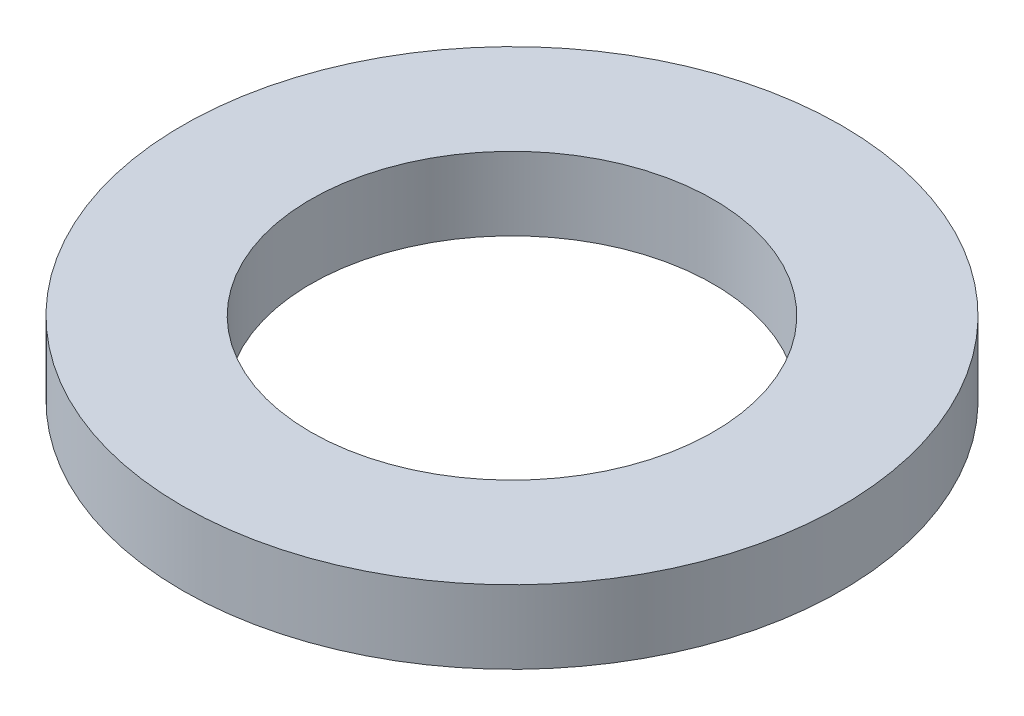
ISO-10303-21;
HEADER;
FILE_DESCRIPTION(('STEP AP214'),'2;1');
FILE_NAME('part.step','',(''),(''),'','','');
FILE_SCHEMA(('AUTOMOTIVE_DESIGN { 1 0 10303 214 1 1 1 1 }'));
ENDSEC;
DATA;
#1=APPLICATION_CONTEXT('core data for automotive mechanical design processes');
#2=APPLICATION_PROTOCOL_DEFINITION('international standard','automotive_design',2000,#1);
#3=PRODUCT_CONTEXT('',#1,'mechanical');
#4=PRODUCT('Part','Part','',(#3));
#5=PRODUCT_RELATED_PRODUCT_CATEGORY('part','',(#4));
#6=PRODUCT_DEFINITION_FORMATION('','',#4);
#7=PRODUCT_DEFINITION_CONTEXT('part definition',#1,'design');
#8=PRODUCT_DEFINITION('design','',#6,#7);
#9=PRODUCT_DEFINITION_SHAPE('','',#8);
#10=(LENGTH_UNIT() NAMED_UNIT(*) SI_UNIT(.MILLI.,.METRE.));
#11=(NAMED_UNIT(*) PLANE_ANGLE_UNIT() SI_UNIT($,.RADIAN.));
#12=(NAMED_UNIT(*) SI_UNIT($,.STERADIAN.) SOLID_ANGLE_UNIT());
#13=UNCERTAINTY_MEASURE_WITH_UNIT(LENGTH_MEASURE(1.E-05),#10,'distance_accuracy_value','');
#14=(GEOMETRIC_REPRESENTATION_CONTEXT(3) GLOBAL_UNCERTAINTY_ASSIGNED_CONTEXT((#13)) GLOBAL_UNIT_ASSIGNED_CONTEXT((#10,
#11,#12)) REPRESENTATION_CONTEXT('',''));
#15=CARTESIAN_POINT('',(0.,0.,0.));
#16=DIRECTION('',(0.,0.,1.));
#17=DIRECTION('',(1.,0.,0.));
#18=AXIS2_PLACEMENT_3D('',#15,#16,#17);
#19=CARTESIAN_POINT('',(0.,0.,0.));
#20=DIRECTION('',(0.,1.,0.));
#21=DIRECTION('',(0.,0.,1.));
#22=AXIS2_PLACEMENT_3D('',#19,#20,#21);
#23=CYLINDRICAL_SURFACE('',#22,5.5);
#24=CARTESIAN_POINT('',(0.,0.,0.));
#25=DIRECTION('',(0.,1.,0.));
#26=DIRECTION('',(0.,0.,1.));
#27=AXIS2_PLACEMENT_3D('',#24,#25,#26);
#28=CIRCLE('',#27,5.5);
#29=CARTESIAN_POINT('',(0.,0.,5.5));
#30=VERTEX_POINT('',#29);
#31=EDGE_CURVE('E10',#30,#30,#28,.T.);
#32=ORIENTED_EDGE('',*,*,#31,.T.);
#33=EDGE_LOOP('',(#32));
#34=FACE_BOUND('',#33,.T.);
#35=CARTESIAN_POINT('',(0.,-2.,0.));
#36=DIRECTION('',(0.,1.,0.));
#37=DIRECTION('',(0.,0.,1.));
#38=AXIS2_PLACEMENT_3D('',#35,#36,#37);
#39=CIRCLE('',#38,5.5);
#40=CARTESIAN_POINT('',(0.,-2.,5.5));
#41=VERTEX_POINT('',#40);
#42=EDGE_CURVE('E46',#41,#41,#39,.T.);
#43=ORIENTED_EDGE('',*,*,#42,.F.);
#44=EDGE_LOOP('',(#43));
#45=FACE_BOUND('',#44,.T.);
#46=ADVANCED_FACE('F32',(#34,#45),#23,.F.);
#47=CARTESIAN_POINT('',(5.5,0.,0.));
#48=DIRECTION('',(0.,1.,0.));
#49=DIRECTION('',(0.,0.,1.));
#50=AXIS2_PLACEMENT_3D('',#47,#48,#49);
#51=PLANE('',#50);
#52=CARTESIAN_POINT('',(0.,0.,0.));
#53=DIRECTION('',(0.,1.,0.));
#54=DIRECTION('',(0.,0.,1.));
#55=AXIS2_PLACEMENT_3D('',#52,#53,#54);
#56=CIRCLE('',#55,9.);
#57=CARTESIAN_POINT('',(0.,0.,9.));
#58=VERTEX_POINT('',#57);
#59=EDGE_CURVE('E38',#58,#58,#56,.T.);
#60=ORIENTED_EDGE('',*,*,#59,.T.);
#61=EDGE_LOOP('',(#60));
#62=FACE_BOUND('',#61,.T.);
#63=ORIENTED_EDGE('',*,*,#31,.F.);
#64=EDGE_LOOP('',(#63));
#65=FACE_BOUND('',#64,.T.);
#66=ADVANCED_FACE('F56',(#62,#65),#51,.T.);
#67=CARTESIAN_POINT('',(0.,0.,0.));
#68=DIRECTION('',(0.,1.,0.));
#69=DIRECTION('',(0.,0.,1.));
#70=AXIS2_PLACEMENT_3D('',#67,#68,#69);
#71=CYLINDRICAL_SURFACE('',#70,9.);
#72=CARTESIAN_POINT('',(0.,-2.,0.));
#73=DIRECTION('',(0.,1.,0.));
#74=DIRECTION('',(0.,0.,1.));
#75=AXIS2_PLACEMENT_3D('',#72,#73,#74);
#76=CIRCLE('',#75,9.);
#77=CARTESIAN_POINT('',(0.,-2.,9.));
#78=VERTEX_POINT('',#77);
#79=EDGE_CURVE('E42',#78,#78,#76,.T.);
#80=ORIENTED_EDGE('',*,*,#79,.T.);
#81=EDGE_LOOP('',(#80));
#82=FACE_BOUND('',#81,.T.);
#83=ORIENTED_EDGE('',*,*,#59,.F.);
#84=EDGE_LOOP('',(#83));
#85=FACE_BOUND('',#84,.T.);
#86=ADVANCED_FACE('F60',(#82,#85),#71,.T.);
#87=CARTESIAN_POINT('',(5.5,-2.,0.));
#88=DIRECTION('',(0.,-1.,0.));
#89=DIRECTION('',(0.,0.,-1.));
#90=AXIS2_PLACEMENT_3D('',#87,#88,#89);
#91=PLANE('',#90);
#92=ORIENTED_EDGE('',*,*,#42,.T.);
#93=EDGE_LOOP('',(#92));
#94=FACE_BOUND('',#93,.T.);
#95=ORIENTED_EDGE('',*,*,#79,.F.);
#96=EDGE_LOOP('',(#95));
#97=FACE_BOUND('',#96,.T.);
#98=ADVANCED_FACE('F52',(#94,#97),#91,.T.);
#99=CLOSED_SHELL('',(#46,#66,#86,#98));
#100=MANIFOLD_SOLID_BREP('B2',#99);
#101=ADVANCED_BREP_SHAPE_REPRESENTATION('',(#18,#100),#14);
#102=SHAPE_DEFINITION_REPRESENTATION(#9,#101);
ENDSEC;
END-ISO-10303-21;
